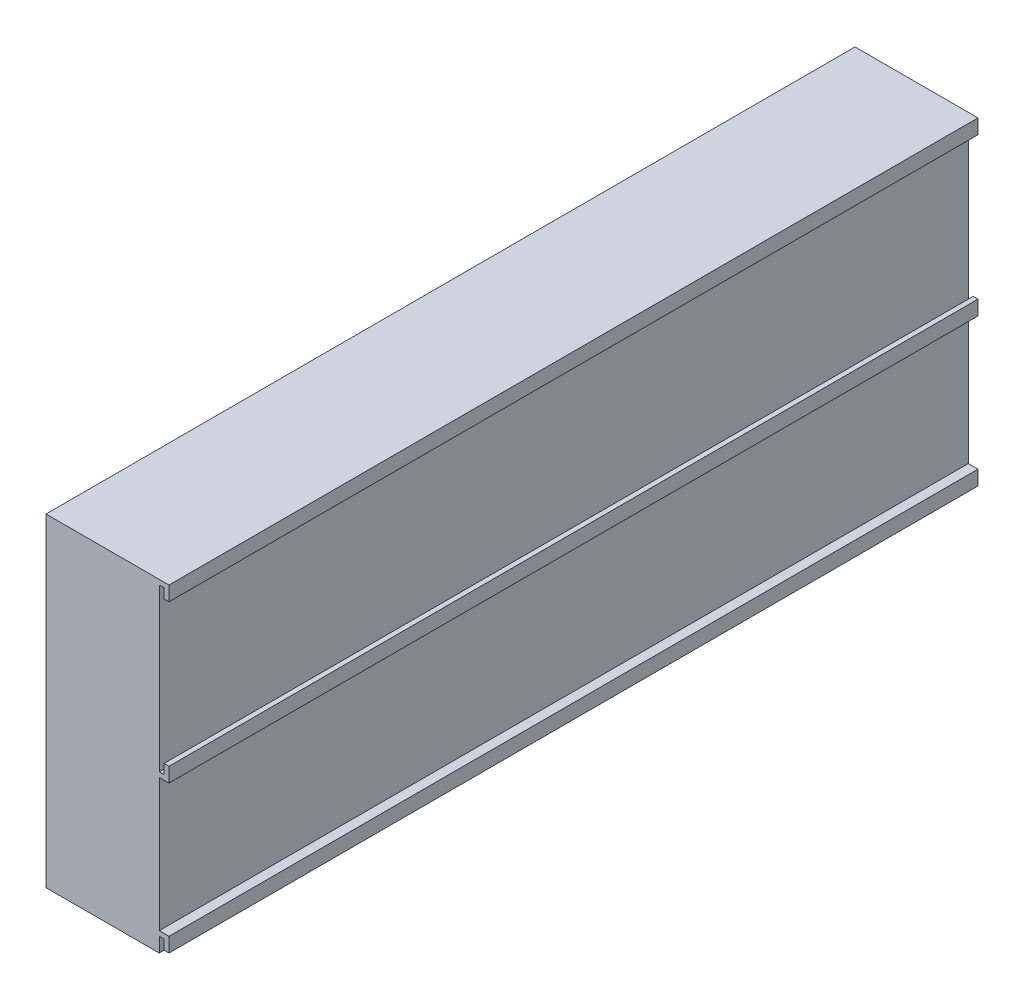
ISO-10303-21;
HEADER;
FILE_DESCRIPTION(('STEP AP214'),'2;1');
FILE_NAME('part.step','',(''),(''),'','','');
FILE_SCHEMA(('AUTOMOTIVE_DESIGN { 1 0 10303 214 1 1 1 1 }'));
ENDSEC;
DATA;
#1=APPLICATION_CONTEXT('core data for automotive mechanical design processes');
#2=APPLICATION_PROTOCOL_DEFINITION('international standard','automotive_design',2000,#1);
#3=PRODUCT_CONTEXT('',#1,'mechanical');
#4=PRODUCT('Part','Part','',(#3));
#5=PRODUCT_RELATED_PRODUCT_CATEGORY('part','',(#4));
#6=PRODUCT_DEFINITION_FORMATION('','',#4);
#7=PRODUCT_DEFINITION_CONTEXT('part definition',#1,'design');
#8=PRODUCT_DEFINITION('design','',#6,#7);
#9=PRODUCT_DEFINITION_SHAPE('','',#8);
#10=(LENGTH_UNIT() NAMED_UNIT(*) SI_UNIT(.MILLI.,.METRE.));
#11=(NAMED_UNIT(*) PLANE_ANGLE_UNIT() SI_UNIT($,.RADIAN.));
#12=(NAMED_UNIT(*) SI_UNIT($,.STERADIAN.) SOLID_ANGLE_UNIT());
#13=UNCERTAINTY_MEASURE_WITH_UNIT(LENGTH_MEASURE(1.E-05),#10,'distance_accuracy_value','');
#14=(GEOMETRIC_REPRESENTATION_CONTEXT(3) GLOBAL_UNCERTAINTY_ASSIGNED_CONTEXT((#13)) GLOBAL_UNIT_ASSIGNED_CONTEXT((#10,
#11,#12)) REPRESENTATION_CONTEXT('',''));
#15=CARTESIAN_POINT('',(0.,0.,0.));
#16=DIRECTION('',(0.,0.,1.));
#17=DIRECTION('',(1.,0.,0.));
#18=AXIS2_PLACEMENT_3D('',#15,#16,#17);
#19=CARTESIAN_POINT('',(-17.5,-50.,250.));
#20=DIRECTION('',(1.,0.,0.));
#21=DIRECTION('',(0.,0.,-1.));
#22=AXIS2_PLACEMENT_3D('',#19,#20,#21);
#23=PLANE('',#22);
#24=DIRECTION('',(0.,-1.,0.));
#25=VECTOR('',#24,1.);
#26=CARTESIAN_POINT('',(-17.5,-50.,0.));
#27=LINE('',#26,#25);
#28=CARTESIAN_POINT('',(-17.5,50.,0.));
#29=VERTEX_POINT('',#28);
#30=CARTESIAN_POINT('',(-17.5,-50.,0.));
#31=VERTEX_POINT('',#30);
#32=EDGE_CURVE('E216',#29,#31,#27,.T.);
#33=ORIENTED_EDGE('',*,*,#32,.T.);
#34=DIRECTION('',(0.,0.,-1.));
#35=VECTOR('',#34,1.);
#36=CARTESIAN_POINT('',(-17.5,-50.,250.));
#37=LINE('',#36,#35);
#38=CARTESIAN_POINT('',(-17.5,-50.,250.));
#39=VERTEX_POINT('',#38);
#40=EDGE_CURVE('E48',#39,#31,#37,.T.);
#41=ORIENTED_EDGE('',*,*,#40,.F.);
#42=DIRECTION('',(0.,-1.,0.));
#43=VECTOR('',#42,1.);
#44=CARTESIAN_POINT('',(-17.5,-50.,250.));
#45=LINE('',#44,#43);
#46=CARTESIAN_POINT('',(-17.5,50.,250.));
#47=VERTEX_POINT('',#46);
#48=EDGE_CURVE('E136',#47,#39,#45,.T.);
#49=ORIENTED_EDGE('',*,*,#48,.F.);
#50=DIRECTION('',(0.,0.,-1.));
#51=VECTOR('',#50,1.);
#52=CARTESIAN_POINT('',(-17.5,50.,250.));
#53=LINE('',#52,#51);
#54=EDGE_CURVE('E11',#47,#29,#53,.T.);
#55=ORIENTED_EDGE('',*,*,#54,.T.);
#56=EDGE_LOOP('',(#33,#41,#49,#55));
#57=FACE_BOUND('',#56,.T.);
#58=ADVANCED_FACE('F39',(#57),#23,.F.);
#59=CARTESIAN_POINT('',(-17.5,-50.,250.));
#60=DIRECTION('',(0.,1.,0.));
#61=DIRECTION('',(0.,0.,1.));
#62=AXIS2_PLACEMENT_3D('',#59,#60,#61);
#63=PLANE('',#62);
#64=DIRECTION('',(1.,0.,0.));
#65=VECTOR('',#64,1.);
#66=CARTESIAN_POINT('',(-17.5,-50.,0.));
#67=LINE('',#66,#65);
#68=CARTESIAN_POINT('',(17.5,-50.,0.));
#69=VERTEX_POINT('',#68);
#70=EDGE_CURVE('E219',#31,#69,#67,.T.);
#71=ORIENTED_EDGE('',*,*,#70,.T.);
#72=DIRECTION('',(0.,0.,-1.));
#73=VECTOR('',#72,1.);
#74=CARTESIAN_POINT('',(17.5,-50.,250.));
#75=LINE('',#74,#73);
#76=CARTESIAN_POINT('',(17.5,-50.,250.));
#77=VERTEX_POINT('',#76);
#78=EDGE_CURVE('E331',#77,#69,#75,.T.);
#79=ORIENTED_EDGE('',*,*,#78,.F.);
#80=DIRECTION('',(1.,0.,0.));
#81=VECTOR('',#80,1.);
#82=CARTESIAN_POINT('',(-17.5,-50.,250.));
#83=LINE('',#82,#81);
#84=EDGE_CURVE('E341',#39,#77,#83,.T.);
#85=ORIENTED_EDGE('',*,*,#84,.F.);
#86=ORIENTED_EDGE('',*,*,#40,.T.);
#87=EDGE_LOOP('',(#71,#79,#85,#86));
#88=FACE_BOUND('',#87,.T.);
#89=ADVANCED_FACE('F339',(#88),#63,.F.);
#90=CARTESIAN_POINT('',(17.5,-50.,250.));
#91=DIRECTION('',(-1.,0.,0.));
#92=DIRECTION('',(0.,0.,1.));
#93=AXIS2_PLACEMENT_3D('',#90,#91,#92);
#94=PLANE('',#93);
#95=DIRECTION('',(0.,1.,0.));
#96=VECTOR('',#95,1.);
#97=CARTESIAN_POINT('',(17.5,-50.,0.));
#98=LINE('',#97,#96);
#99=CARTESIAN_POINT('',(17.5,-45.5,0.));
#100=VERTEX_POINT('',#99);
#101=EDGE_CURVE('E222',#69,#100,#98,.T.);
#102=ORIENTED_EDGE('',*,*,#101,.T.);
#103=DIRECTION('',(0.,0.,-1.));
#104=VECTOR('',#103,1.);
#105=CARTESIAN_POINT('',(17.5,-45.5,250.));
#106=LINE('',#105,#104);
#107=CARTESIAN_POINT('',(17.5,-45.5,250.));
#108=VERTEX_POINT('',#107);
#109=EDGE_CURVE('E327',#108,#100,#106,.T.);
#110=ORIENTED_EDGE('',*,*,#109,.F.);
#111=DIRECTION('',(0.,1.,0.));
#112=VECTOR('',#111,1.);
#113=CARTESIAN_POINT('',(17.5,-50.,250.));
#114=LINE('',#113,#112);
#115=EDGE_CURVE('E361',#77,#108,#114,.T.);
#116=ORIENTED_EDGE('',*,*,#115,.F.);
#117=ORIENTED_EDGE('',*,*,#78,.T.);
#118=EDGE_LOOP('',(#102,#110,#116,#117));
#119=FACE_BOUND('',#118,.T.);
#120=ADVANCED_FACE('F351',(#119),#94,.F.);
#121=CARTESIAN_POINT('',(19.,-45.5,250.));
#122=DIRECTION('',(0.,1.,0.));
#123=DIRECTION('',(0.,0.,1.));
#124=AXIS2_PLACEMENT_3D('',#121,#122,#123);
#125=PLANE('',#124);
#126=DIRECTION('',(1.,0.,0.));
#127=VECTOR('',#126,1.);
#128=CARTESIAN_POINT('',(19.,-45.5,0.));
#129=LINE('',#128,#127);
#130=CARTESIAN_POINT('',(19.,-45.5,0.));
#131=VERTEX_POINT('',#130);
#132=EDGE_CURVE('E225',#100,#131,#129,.T.);
#133=ORIENTED_EDGE('',*,*,#132,.T.);
#134=DIRECTION('',(0.,0.,-1.));
#135=VECTOR('',#134,1.);
#136=CARTESIAN_POINT('',(19.,-45.5,250.));
#137=LINE('',#136,#135);
#138=CARTESIAN_POINT('',(19.,-45.5,250.));
#139=VERTEX_POINT('',#138);
#140=EDGE_CURVE('E323',#139,#131,#137,.T.);
#141=ORIENTED_EDGE('',*,*,#140,.F.);
#142=DIRECTION('',(1.,0.,0.));
#143=VECTOR('',#142,1.);
#144=CARTESIAN_POINT('',(19.,-45.5,250.));
#145=LINE('',#144,#143);
#146=EDGE_CURVE('E357',#108,#139,#145,.T.);
#147=ORIENTED_EDGE('',*,*,#146,.F.);
#148=ORIENTED_EDGE('',*,*,#109,.T.);
#149=EDGE_LOOP('',(#133,#141,#147,#148));
#150=FACE_BOUND('',#149,.T.);
#151=ADVANCED_FACE('F355',(#150),#125,.F.);
#152=CARTESIAN_POINT('',(19.,-48.5,250.));
#153=DIRECTION('',(1.,0.,0.));
#154=DIRECTION('',(0.,1.,0.));
#155=AXIS2_PLACEMENT_3D('',#152,#153,#154);
#156=PLANE('',#155);
#157=DIRECTION('',(0.,-1.,0.));
#158=VECTOR('',#157,1.);
#159=CARTESIAN_POINT('',(19.,-48.5,0.));
#160=LINE('',#159,#158);
#161=CARTESIAN_POINT('',(19.,-48.5,0.));
#162=VERTEX_POINT('',#161);
#163=EDGE_CURVE('E228',#131,#162,#160,.T.);
#164=ORIENTED_EDGE('',*,*,#163,.T.);
#165=DIRECTION('',(0.,0.,-1.));
#166=VECTOR('',#165,1.);
#167=CARTESIAN_POINT('',(19.,-48.5,250.));
#168=LINE('',#167,#166);
#169=CARTESIAN_POINT('',(19.,-48.5,250.));
#170=VERTEX_POINT('',#169);
#171=EDGE_CURVE('E319',#170,#162,#168,.T.);
#172=ORIENTED_EDGE('',*,*,#171,.F.);
#173=DIRECTION('',(0.,-1.,0.));
#174=VECTOR('',#173,1.);
#175=CARTESIAN_POINT('',(19.,-48.5,250.));
#176=LINE('',#175,#174);
#177=EDGE_CURVE('E360',#139,#170,#176,.T.);
#178=ORIENTED_EDGE('',*,*,#177,.F.);
#179=ORIENTED_EDGE('',*,*,#140,.T.);
#180=EDGE_LOOP('',(#164,#172,#178,#179));
#181=FACE_BOUND('',#180,.T.);
#182=ADVANCED_FACE('F435',(#181),#156,.F.);
#183=CARTESIAN_POINT('',(20.5,-48.5,250.));
#184=DIRECTION('',(0.,1.,0.));
#185=DIRECTION('',(0.,0.,1.));
#186=AXIS2_PLACEMENT_3D('',#183,#184,#185);
#187=PLANE('',#186);
#188=DIRECTION('',(1.,0.,0.));
#189=VECTOR('',#188,1.);
#190=CARTESIAN_POINT('',(20.5,-48.5,0.));
#191=LINE('',#190,#189);
#192=CARTESIAN_POINT('',(20.5,-48.5,0.));
#193=VERTEX_POINT('',#192);
#194=EDGE_CURVE('E231',#162,#193,#191,.T.);
#195=ORIENTED_EDGE('',*,*,#194,.T.);
#196=DIRECTION('',(0.,0.,-1.));
#197=VECTOR('',#196,1.);
#198=CARTESIAN_POINT('',(20.5,-48.5,250.));
#199=LINE('',#198,#197);
#200=CARTESIAN_POINT('',(20.5,-48.5,250.));
#201=VERTEX_POINT('',#200);
#202=EDGE_CURVE('E315',#201,#193,#199,.T.);
#203=ORIENTED_EDGE('',*,*,#202,.F.);
#204=DIRECTION('',(1.,0.,0.));
#205=VECTOR('',#204,1.);
#206=CARTESIAN_POINT('',(20.5,-48.5,250.));
#207=LINE('',#206,#205);
#208=EDGE_CURVE('E365',#170,#201,#207,.T.);
#209=ORIENTED_EDGE('',*,*,#208,.F.);
#210=ORIENTED_EDGE('',*,*,#171,.T.);
#211=EDGE_LOOP('',(#195,#203,#209,#210));
#212=FACE_BOUND('',#211,.T.);
#213=ADVANCED_FACE('F438',(#212),#187,.F.);
#214=CARTESIAN_POINT('',(20.5,-44.,250.));
#215=DIRECTION('',(-1.,0.,0.));
#216=DIRECTION('',(0.,0.,1.));
#217=AXIS2_PLACEMENT_3D('',#214,#215,#216);
#218=PLANE('',#217);
#219=DIRECTION('',(0.,1.,0.));
#220=VECTOR('',#219,1.);
#221=CARTESIAN_POINT('',(20.5,-44.,0.));
#222=LINE('',#221,#220);
#223=CARTESIAN_POINT('',(20.5,-44.,0.));
#224=VERTEX_POINT('',#223);
#225=EDGE_CURVE('E234',#193,#224,#222,.T.);
#226=ORIENTED_EDGE('',*,*,#225,.T.);
#227=DIRECTION('',(0.,0.,-1.));
#228=VECTOR('',#227,1.);
#229=CARTESIAN_POINT('',(20.5,-44.,250.));
#230=LINE('',#229,#228);
#231=CARTESIAN_POINT('',(20.5,-44.,250.));
#232=VERTEX_POINT('',#231);
#233=EDGE_CURVE('E311',#232,#224,#230,.T.);
#234=ORIENTED_EDGE('',*,*,#233,.F.);
#235=DIRECTION('',(0.,1.,0.));
#236=VECTOR('',#235,1.);
#237=CARTESIAN_POINT('',(20.5,-44.,250.));
#238=LINE('',#237,#236);
#239=EDGE_CURVE('E372',#201,#232,#238,.T.);
#240=ORIENTED_EDGE('',*,*,#239,.F.);
#241=ORIENTED_EDGE('',*,*,#202,.T.);
#242=EDGE_LOOP('',(#226,#234,#240,#241));
#243=FACE_BOUND('',#242,.T.);
#244=ADVANCED_FACE('F442',(#243),#218,.F.);
#245=CARTESIAN_POINT('',(17.5,-44.,250.));
#246=DIRECTION('',(0.,-1.,0.));
#247=DIRECTION('',(1.,0.,0.));
#248=AXIS2_PLACEMENT_3D('',#245,#246,#247);
#249=PLANE('',#248);
#250=DIRECTION('',(-1.,0.,0.));
#251=VECTOR('',#250,1.);
#252=CARTESIAN_POINT('',(17.5,-44.,0.));
#253=LINE('',#252,#251);
#254=CARTESIAN_POINT('',(17.5,-44.,0.));
#255=VERTEX_POINT('',#254);
#256=EDGE_CURVE('E237',#224,#255,#253,.T.);
#257=ORIENTED_EDGE('',*,*,#256,.T.);
#258=DIRECTION('',(0.,0.,-1.));
#259=VECTOR('',#258,1.);
#260=CARTESIAN_POINT('',(17.5,-44.,250.));
#261=LINE('',#260,#259);
#262=CARTESIAN_POINT('',(17.5,-44.,250.));
#263=VERTEX_POINT('',#262);
#264=EDGE_CURVE('E307',#263,#255,#261,.T.);
#265=ORIENTED_EDGE('',*,*,#264,.F.);
#266=DIRECTION('',(-1.,0.,0.));
#267=VECTOR('',#266,1.);
#268=CARTESIAN_POINT('',(17.5,-44.,250.));
#269=LINE('',#268,#267);
#270=EDGE_CURVE('E375',#232,#263,#269,.T.);
#271=ORIENTED_EDGE('',*,*,#270,.F.);
#272=ORIENTED_EDGE('',*,*,#233,.T.);
#273=EDGE_LOOP('',(#257,#265,#271,#272));
#274=FACE_BOUND('',#273,.T.);
#275=ADVANCED_FACE('F446',(#274),#249,.F.);
#276=CARTESIAN_POINT('',(17.5,-44.,250.));
#277=DIRECTION('',(-1.,0.,0.));
#278=DIRECTION('',(0.,0.,1.));
#279=AXIS2_PLACEMENT_3D('',#276,#277,#278);
#280=PLANE('',#279);
#281=DIRECTION('',(0.,1.,0.));
#282=VECTOR('',#281,1.);
#283=CARTESIAN_POINT('',(17.5,-44.,0.));
#284=LINE('',#283,#282);
#285=CARTESIAN_POINT('',(17.5,-3.,0.));
#286=VERTEX_POINT('',#285);
#287=EDGE_CURVE('E240',#255,#286,#284,.T.);
#288=ORIENTED_EDGE('',*,*,#287,.T.);
#289=DIRECTION('',(0.,0.,-1.));
#290=VECTOR('',#289,1.);
#291=CARTESIAN_POINT('',(17.5,-3.,250.));
#292=LINE('',#291,#290);
#293=CARTESIAN_POINT('',(17.5,-3.,250.));
#294=VERTEX_POINT('',#293);
#295=EDGE_CURVE('E303',#294,#286,#292,.T.);
#296=ORIENTED_EDGE('',*,*,#295,.F.);
#297=DIRECTION('',(0.,1.,0.));
#298=VECTOR('',#297,1.);
#299=CARTESIAN_POINT('',(17.5,-44.,250.));
#300=LINE('',#299,#298);
#301=EDGE_CURVE('E378',#263,#294,#300,.T.);
#302=ORIENTED_EDGE('',*,*,#301,.F.);
#303=ORIENTED_EDGE('',*,*,#264,.T.);
#304=EDGE_LOOP('',(#288,#296,#302,#303));
#305=FACE_BOUND('',#304,.T.);
#306=ADVANCED_FACE('F450',(#305),#280,.F.);
#307=CARTESIAN_POINT('',(17.5,-3.,250.));
#308=DIRECTION('',(0.,1.,0.));
#309=DIRECTION('',(-1.,0.,0.));
#310=AXIS2_PLACEMENT_3D('',#307,#308,#309);
#311=PLANE('',#310);
#312=DIRECTION('',(1.,0.,0.));
#313=VECTOR('',#312,1.);
#314=CARTESIAN_POINT('',(17.5,-3.,0.));
#315=LINE('',#314,#313);
#316=CARTESIAN_POINT('',(20.5,-3.,0.));
#317=VERTEX_POINT('',#316);
#318=EDGE_CURVE('E243',#286,#317,#315,.T.);
#319=ORIENTED_EDGE('',*,*,#318,.T.);
#320=DIRECTION('',(0.,0.,-1.));
#321=VECTOR('',#320,1.);
#322=CARTESIAN_POINT('',(20.5,-3.,250.));
#323=LINE('',#322,#321);
#324=CARTESIAN_POINT('',(20.5,-3.,250.));
#325=VERTEX_POINT('',#324);
#326=EDGE_CURVE('E299',#325,#317,#323,.T.);
#327=ORIENTED_EDGE('',*,*,#326,.F.);
#328=DIRECTION('',(1.,0.,0.));
#329=VECTOR('',#328,1.);
#330=CARTESIAN_POINT('',(17.5,-3.,250.));
#331=LINE('',#330,#329);
#332=EDGE_CURVE('E381',#294,#325,#331,.T.);
#333=ORIENTED_EDGE('',*,*,#332,.F.);
#334=ORIENTED_EDGE('',*,*,#295,.T.);
#335=EDGE_LOOP('',(#319,#327,#333,#334));
#336=FACE_BOUND('',#335,.T.);
#337=ADVANCED_FACE('F454',(#336),#311,.F.);
#338=CARTESIAN_POINT('',(20.5,-3.,250.));
#339=DIRECTION('',(-1.,0.,0.));
#340=DIRECTION('',(0.,0.,1.));
#341=AXIS2_PLACEMENT_3D('',#338,#339,#340);
#342=PLANE('',#341);
#343=DIRECTION('',(0.,1.,0.));
#344=VECTOR('',#343,1.);
#345=CARTESIAN_POINT('',(20.5,-3.,0.));
#346=LINE('',#345,#344);
#347=CARTESIAN_POINT('',(20.5,1.5,0.));
#348=VERTEX_POINT('',#347);
#349=EDGE_CURVE('E246',#317,#348,#346,.T.);
#350=ORIENTED_EDGE('',*,*,#349,.T.);
#351=DIRECTION('',(0.,0.,-1.));
#352=VECTOR('',#351,1.);
#353=CARTESIAN_POINT('',(20.5,1.5,250.));
#354=LINE('',#353,#352);
#355=CARTESIAN_POINT('',(20.5,1.5,250.));
#356=VERTEX_POINT('',#355);
#357=EDGE_CURVE('E295',#356,#348,#354,.T.);
#358=ORIENTED_EDGE('',*,*,#357,.F.);
#359=DIRECTION('',(0.,1.,0.));
#360=VECTOR('',#359,1.);
#361=CARTESIAN_POINT('',(20.5,-3.,250.));
#362=LINE('',#361,#360);
#363=EDGE_CURVE('E384',#325,#356,#362,.T.);
#364=ORIENTED_EDGE('',*,*,#363,.F.);
#365=ORIENTED_EDGE('',*,*,#326,.T.);
#366=EDGE_LOOP('',(#350,#358,#364,#365));
#367=FACE_BOUND('',#366,.T.);
#368=ADVANCED_FACE('F458',(#367),#342,.F.);
#369=CARTESIAN_POINT('',(20.5,1.5,250.));
#370=DIRECTION('',(0.,-1.,0.));
#371=DIRECTION('',(1.,0.,0.));
#372=AXIS2_PLACEMENT_3D('',#369,#370,#371);
#373=PLANE('',#372);
#374=DIRECTION('',(-1.,0.,0.));
#375=VECTOR('',#374,1.);
#376=CARTESIAN_POINT('',(20.5,1.5,0.));
#377=LINE('',#376,#375);
#378=CARTESIAN_POINT('',(19.,1.5,0.));
#379=VERTEX_POINT('',#378);
#380=EDGE_CURVE('E249',#348,#379,#377,.T.);
#381=ORIENTED_EDGE('',*,*,#380,.T.);
#382=DIRECTION('',(0.,0.,-1.));
#383=VECTOR('',#382,1.);
#384=CARTESIAN_POINT('',(19.,1.5,250.));
#385=LINE('',#384,#383);
#386=CARTESIAN_POINT('',(19.,1.5,250.));
#387=VERTEX_POINT('',#386);
#388=EDGE_CURVE('E291',#387,#379,#385,.T.);
#389=ORIENTED_EDGE('',*,*,#388,.F.);
#390=DIRECTION('',(-1.,0.,0.));
#391=VECTOR('',#390,1.);
#392=CARTESIAN_POINT('',(20.5,1.5,250.));
#393=LINE('',#392,#391);
#394=EDGE_CURVE('E387',#356,#387,#393,.T.);
#395=ORIENTED_EDGE('',*,*,#394,.F.);
#396=ORIENTED_EDGE('',*,*,#357,.T.);
#397=EDGE_LOOP('',(#381,#389,#395,#396));
#398=FACE_BOUND('',#397,.T.);
#399=ADVANCED_FACE('F462',(#398),#373,.F.);
#400=CARTESIAN_POINT('',(19.,1.5,250.));
#401=DIRECTION('',(1.,0.,0.));
#402=DIRECTION('',(0.,0.,-1.));
#403=AXIS2_PLACEMENT_3D('',#400,#401,#402);
#404=PLANE('',#403);
#405=DIRECTION('',(0.,-1.,0.));
#406=VECTOR('',#405,1.);
#407=CARTESIAN_POINT('',(19.,1.5,0.));
#408=LINE('',#407,#406);
#409=CARTESIAN_POINT('',(19.,-1.5,0.));
#410=VERTEX_POINT('',#409);
#411=EDGE_CURVE('E252',#379,#410,#408,.T.);
#412=ORIENTED_EDGE('',*,*,#411,.T.);
#413=DIRECTION('',(0.,0.,-1.));
#414=VECTOR('',#413,1.);
#415=CARTESIAN_POINT('',(19.,-1.5,250.));
#416=LINE('',#415,#414);
#417=CARTESIAN_POINT('',(19.,-1.5,250.));
#418=VERTEX_POINT('',#417);
#419=EDGE_CURVE('E287',#418,#410,#416,.T.);
#420=ORIENTED_EDGE('',*,*,#419,.F.);
#421=DIRECTION('',(0.,-1.,0.));
#422=VECTOR('',#421,1.);
#423=CARTESIAN_POINT('',(19.,1.5,250.));
#424=LINE('',#423,#422);
#425=EDGE_CURVE('E390',#387,#418,#424,.T.);
#426=ORIENTED_EDGE('',*,*,#425,.F.);
#427=ORIENTED_EDGE('',*,*,#388,.T.);
#428=EDGE_LOOP('',(#412,#420,#426,#427));
#429=FACE_BOUND('',#428,.T.);
#430=ADVANCED_FACE('F466',(#429),#404,.F.);
#431=CARTESIAN_POINT('',(19.,-1.5,250.));
#432=DIRECTION('',(0.,-1.,0.));
#433=DIRECTION('',(1.,0.,0.));
#434=AXIS2_PLACEMENT_3D('',#431,#432,#433);
#435=PLANE('',#434);
#436=DIRECTION('',(-1.,0.,0.));
#437=VECTOR('',#436,1.);
#438=CARTESIAN_POINT('',(19.,-1.5,0.));
#439=LINE('',#438,#437);
#440=CARTESIAN_POINT('',(17.5,-1.5,0.));
#441=VERTEX_POINT('',#440);
#442=EDGE_CURVE('E255',#410,#441,#439,.T.);
#443=ORIENTED_EDGE('',*,*,#442,.T.);
#444=DIRECTION('',(0.,0.,-1.));
#445=VECTOR('',#444,1.);
#446=CARTESIAN_POINT('',(17.5,-1.5,250.));
#447=LINE('',#446,#445);
#448=CARTESIAN_POINT('',(17.5,-1.5,250.));
#449=VERTEX_POINT('',#448);
#450=EDGE_CURVE('E283',#449,#441,#447,.T.);
#451=ORIENTED_EDGE('',*,*,#450,.F.);
#452=DIRECTION('',(-1.,0.,0.));
#453=VECTOR('',#452,1.);
#454=CARTESIAN_POINT('',(19.,-1.5,250.));
#455=LINE('',#454,#453);
#456=EDGE_CURVE('E393',#418,#449,#455,.T.);
#457=ORIENTED_EDGE('',*,*,#456,.F.);
#458=ORIENTED_EDGE('',*,*,#419,.T.);
#459=EDGE_LOOP('',(#443,#451,#457,#458));
#460=FACE_BOUND('',#459,.T.);
#461=ADVANCED_FACE('F470',(#460),#435,.F.);
#462=CARTESIAN_POINT('',(17.5,-1.5,250.));
#463=DIRECTION('',(-1.,0.,0.));
#464=DIRECTION('',(0.,0.,1.));
#465=AXIS2_PLACEMENT_3D('',#462,#463,#464);
#466=PLANE('',#465);
#467=DIRECTION('',(0.,1.,0.));
#468=VECTOR('',#467,1.);
#469=CARTESIAN_POINT('',(17.5,-1.5,0.));
#470=LINE('',#469,#468);
#471=CARTESIAN_POINT('',(17.5,48.5,0.));
#472=VERTEX_POINT('',#471);
#473=EDGE_CURVE('E258',#441,#472,#470,.T.);
#474=ORIENTED_EDGE('',*,*,#473,.T.);
#475=DIRECTION('',(0.,0.,-1.));
#476=VECTOR('',#475,1.);
#477=CARTESIAN_POINT('',(17.5,48.5,250.));
#478=LINE('',#477,#476);
#479=CARTESIAN_POINT('',(17.5,48.5,250.));
#480=VERTEX_POINT('',#479);
#481=EDGE_CURVE('E279',#480,#472,#478,.T.);
#482=ORIENTED_EDGE('',*,*,#481,.F.);
#483=DIRECTION('',(0.,1.,0.));
#484=VECTOR('',#483,1.);
#485=CARTESIAN_POINT('',(17.5,-1.5,250.));
#486=LINE('',#485,#484);
#487=EDGE_CURVE('E396',#449,#480,#486,.T.);
#488=ORIENTED_EDGE('',*,*,#487,.F.);
#489=ORIENTED_EDGE('',*,*,#450,.T.);
#490=EDGE_LOOP('',(#474,#482,#488,#489));
#491=FACE_BOUND('',#490,.T.);
#492=ADVANCED_FACE('F404',(#491),#466,.F.);
#493=CARTESIAN_POINT('',(19.,48.5,250.));
#494=DIRECTION('',(0.,1.,0.));
#495=DIRECTION('',(0.,0.,1.));
#496=AXIS2_PLACEMENT_3D('',#493,#494,#495);
#497=PLANE('',#496);
#498=DIRECTION('',(1.,0.,0.));
#499=VECTOR('',#498,1.);
#500=CARTESIAN_POINT('',(19.,48.5,0.));
#501=LINE('',#500,#499);
#502=CARTESIAN_POINT('',(19.,48.5,0.));
#503=VERTEX_POINT('',#502);
#504=EDGE_CURVE('E261',#472,#503,#501,.T.);
#505=ORIENTED_EDGE('',*,*,#504,.T.);
#506=DIRECTION('',(0.,0.,-1.));
#507=VECTOR('',#506,1.);
#508=CARTESIAN_POINT('',(19.,48.5,250.));
#509=LINE('',#508,#507);
#510=CARTESIAN_POINT('',(19.,48.5,250.));
#511=VERTEX_POINT('',#510);
#512=EDGE_CURVE('E203',#511,#503,#509,.T.);
#513=ORIENTED_EDGE('',*,*,#512,.F.);
#514=DIRECTION('',(1.,0.,0.));
#515=VECTOR('',#514,1.);
#516=CARTESIAN_POINT('',(19.,48.5,250.));
#517=LINE('',#516,#515);
#518=EDGE_CURVE('E192',#480,#511,#517,.T.);
#519=ORIENTED_EDGE('',*,*,#518,.F.);
#520=ORIENTED_EDGE('',*,*,#481,.T.);
#521=EDGE_LOOP('',(#505,#513,#519,#520));
#522=FACE_BOUND('',#521,.T.);
#523=ADVANCED_FACE('F408',(#522),#497,.F.);
#524=CARTESIAN_POINT('',(19.,45.5,250.));
#525=DIRECTION('',(1.,0.,0.));
#526=DIRECTION('',(0.,1.,0.));
#527=AXIS2_PLACEMENT_3D('',#524,#525,#526);
#528=PLANE('',#527);
#529=DIRECTION('',(0.,-1.,0.));
#530=VECTOR('',#529,1.);
#531=CARTESIAN_POINT('',(19.,45.5,0.));
#532=LINE('',#531,#530);
#533=CARTESIAN_POINT('',(19.,45.5,0.));
#534=VERTEX_POINT('',#533);
#535=EDGE_CURVE('E201',#503,#534,#532,.T.);
#536=ORIENTED_EDGE('',*,*,#535,.T.);
#537=DIRECTION('',(0.,0.,-1.));
#538=VECTOR('',#537,1.);
#539=CARTESIAN_POINT('',(19.,45.5,250.));
#540=LINE('',#539,#538);
#541=CARTESIAN_POINT('',(19.,45.5,250.));
#542=VERTEX_POINT('',#541);
#543=EDGE_CURVE('E198',#542,#534,#540,.T.);
#544=ORIENTED_EDGE('',*,*,#543,.F.);
#545=DIRECTION('',(0.,-1.,0.));
#546=VECTOR('',#545,1.);
#547=CARTESIAN_POINT('',(19.,45.5,250.));
#548=LINE('',#547,#546);
#549=EDGE_CURVE('E186',#511,#542,#548,.T.);
#550=ORIENTED_EDGE('',*,*,#549,.F.);
#551=ORIENTED_EDGE('',*,*,#512,.T.);
#552=EDGE_LOOP('',(#536,#544,#550,#551));
#553=FACE_BOUND('',#552,.T.);
#554=ADVANCED_FACE('F199',(#553),#528,.F.);
#555=CARTESIAN_POINT('',(20.5,45.5,250.));
#556=DIRECTION('',(0.,1.,0.));
#557=DIRECTION('',(0.,0.,1.));
#558=AXIS2_PLACEMENT_3D('',#555,#556,#557);
#559=PLANE('',#558);
#560=DIRECTION('',(1.,0.,0.));
#561=VECTOR('',#560,1.);
#562=CARTESIAN_POINT('',(20.5,45.5,0.));
#563=LINE('',#562,#561);
#564=CARTESIAN_POINT('',(20.5,45.5,0.));
#565=VERTEX_POINT('',#564);
#566=EDGE_CURVE('E122',#534,#565,#563,.T.);
#567=ORIENTED_EDGE('',*,*,#566,.T.);
#568=DIRECTION('',(0.,0.,-1.));
#569=VECTOR('',#568,1.);
#570=CARTESIAN_POINT('',(20.5,45.5,250.));
#571=LINE('',#570,#569);
#572=CARTESIAN_POINT('',(20.5,45.5,250.));
#573=VERTEX_POINT('',#572);
#574=EDGE_CURVE('E204',#573,#565,#571,.T.);
#575=ORIENTED_EDGE('',*,*,#574,.F.);
#576=DIRECTION('',(1.,0.,0.));
#577=VECTOR('',#576,1.);
#578=CARTESIAN_POINT('',(20.5,45.5,250.));
#579=LINE('',#578,#577);
#580=EDGE_CURVE('E190',#542,#573,#579,.T.);
#581=ORIENTED_EDGE('',*,*,#580,.F.);
#582=ORIENTED_EDGE('',*,*,#543,.T.);
#583=EDGE_LOOP('',(#567,#575,#581,#582));
#584=FACE_BOUND('',#583,.T.);
#585=ADVANCED_FACE('F206',(#584),#559,.F.);
#586=CARTESIAN_POINT('',(20.5,50.,250.));
#587=DIRECTION('',(-1.,0.,0.));
#588=DIRECTION('',(0.,0.,1.));
#589=AXIS2_PLACEMENT_3D('',#586,#587,#588);
#590=PLANE('',#589);
#591=DIRECTION('',(0.,1.,0.));
#592=VECTOR('',#591,1.);
#593=CARTESIAN_POINT('',(20.5,50.,0.));
#594=LINE('',#593,#592);
#595=CARTESIAN_POINT('',(20.5,50.,0.));
#596=VERTEX_POINT('',#595);
#597=EDGE_CURVE('E129',#565,#596,#594,.T.);
#598=ORIENTED_EDGE('',*,*,#597,.T.);
#599=DIRECTION('',(0.,0.,-1.));
#600=VECTOR('',#599,1.);
#601=CARTESIAN_POINT('',(20.5,50.,250.));
#602=LINE('',#601,#600);
#603=CARTESIAN_POINT('',(20.5,50.,250.));
#604=VERTEX_POINT('',#603);
#605=EDGE_CURVE('E212',#604,#596,#602,.T.);
#606=ORIENTED_EDGE('',*,*,#605,.F.);
#607=DIRECTION('',(0.,1.,0.));
#608=VECTOR('',#607,1.);
#609=CARTESIAN_POINT('',(20.5,50.,250.));
#610=LINE('',#609,#608);
#611=EDGE_CURVE('E209',#573,#604,#610,.T.);
#612=ORIENTED_EDGE('',*,*,#611,.F.);
#613=ORIENTED_EDGE('',*,*,#574,.T.);
#614=EDGE_LOOP('',(#598,#606,#612,#613));
#615=FACE_BOUND('',#614,.T.);
#616=ADVANCED_FACE('F410',(#615),#590,.F.);
#617=CARTESIAN_POINT('',(17.5,50.,250.));
#618=DIRECTION('',(0.,-1.,0.));
#619=DIRECTION('',(0.,0.,-1.));
#620=AXIS2_PLACEMENT_3D('',#617,#618,#619);
#621=PLANE('',#620);
#622=DIRECTION('',(-1.,0.,0.));
#623=VECTOR('',#622,1.);
#624=CARTESIAN_POINT('',(17.5,50.,0.));
#625=LINE('',#624,#623);
#626=EDGE_CURVE('E270',#596,#29,#625,.T.);
#627=ORIENTED_EDGE('',*,*,#626,.T.);
#628=ORIENTED_EDGE('',*,*,#54,.F.);
#629=DIRECTION('',(-1.,0.,0.));
#630=VECTOR('',#629,1.);
#631=CARTESIAN_POINT('',(-17.5,50.,250.));
#632=LINE('',#631,#630);
#633=EDGE_CURVE('E56',#604,#47,#632,.T.);
#634=ORIENTED_EDGE('',*,*,#633,.F.);
#635=ORIENTED_EDGE('',*,*,#605,.T.);
#636=EDGE_LOOP('',(#627,#628,#634,#635));
#637=FACE_BOUND('',#636,.T.);
#638=ADVANCED_FACE('F409',(#637),#621,.F.);
#639=CARTESIAN_POINT('',(0.,0.,250.));
#640=DIRECTION('',(0.,0.,-1.));
#641=DIRECTION('',(-1.,0.,0.));
#642=AXIS2_PLACEMENT_3D('',#639,#640,#641);
#643=PLANE('',#642);
#644=ORIENTED_EDGE('',*,*,#633,.T.);
#645=ORIENTED_EDGE('',*,*,#48,.T.);
#646=ORIENTED_EDGE('',*,*,#84,.T.);
#647=ORIENTED_EDGE('',*,*,#115,.T.);
#648=ORIENTED_EDGE('',*,*,#146,.T.);
#649=ORIENTED_EDGE('',*,*,#177,.T.);
#650=ORIENTED_EDGE('',*,*,#208,.T.);
#651=ORIENTED_EDGE('',*,*,#239,.T.);
#652=ORIENTED_EDGE('',*,*,#270,.T.);
#653=ORIENTED_EDGE('',*,*,#301,.T.);
#654=ORIENTED_EDGE('',*,*,#332,.T.);
#655=ORIENTED_EDGE('',*,*,#363,.T.);
#656=ORIENTED_EDGE('',*,*,#394,.T.);
#657=ORIENTED_EDGE('',*,*,#425,.T.);
#658=ORIENTED_EDGE('',*,*,#456,.T.);
#659=ORIENTED_EDGE('',*,*,#487,.T.);
#660=ORIENTED_EDGE('',*,*,#518,.T.);
#661=ORIENTED_EDGE('',*,*,#549,.T.);
#662=ORIENTED_EDGE('',*,*,#580,.T.);
#663=ORIENTED_EDGE('',*,*,#611,.T.);
#664=EDGE_LOOP('',(#644,#645,#646,#647,#648,#649,#650,#651,#652,#653,#654,#655,#656,#657,#658,
#659,#660,#661,#662,#663));
#665=FACE_BOUND('',#664,.T.);
#666=ADVANCED_FACE('F188',(#665),#643,.F.);
#667=CARTESIAN_POINT('',(0.,0.,0.));
#668=DIRECTION('',(0.,0.,-1.));
#669=DIRECTION('',(-1.,0.,0.));
#670=AXIS2_PLACEMENT_3D('',#667,#668,#669);
#671=PLANE('',#670);
#672=ORIENTED_EDGE('',*,*,#32,.F.);
#673=ORIENTED_EDGE('',*,*,#626,.F.);
#674=ORIENTED_EDGE('',*,*,#597,.F.);
#675=ORIENTED_EDGE('',*,*,#566,.F.);
#676=ORIENTED_EDGE('',*,*,#535,.F.);
#677=ORIENTED_EDGE('',*,*,#504,.F.);
#678=ORIENTED_EDGE('',*,*,#473,.F.);
#679=ORIENTED_EDGE('',*,*,#442,.F.);
#680=ORIENTED_EDGE('',*,*,#411,.F.);
#681=ORIENTED_EDGE('',*,*,#380,.F.);
#682=ORIENTED_EDGE('',*,*,#349,.F.);
#683=ORIENTED_EDGE('',*,*,#318,.F.);
#684=ORIENTED_EDGE('',*,*,#287,.F.);
#685=ORIENTED_EDGE('',*,*,#256,.F.);
#686=ORIENTED_EDGE('',*,*,#225,.F.);
#687=ORIENTED_EDGE('',*,*,#194,.F.);
#688=ORIENTED_EDGE('',*,*,#163,.F.);
#689=ORIENTED_EDGE('',*,*,#132,.F.);
#690=ORIENTED_EDGE('',*,*,#101,.F.);
#691=ORIENTED_EDGE('',*,*,#70,.F.);
#692=EDGE_LOOP('',(#672,#673,#674,#675,#676,#677,#678,#679,#680,#681,#682,#683,#684,#685,#686,
#687,#688,#689,#690,#691));
#693=FACE_BOUND('',#692,.T.);
#694=ADVANCED_FACE('F345',(#693),#671,.T.);
#695=CLOSED_SHELL('',(#58,#89,#120,#151,#182,#213,#244,#275,#306,#337,#368,#399,#430,#461,#492,
#523,#554,#585,#616,#638,#666,#694));
#696=MANIFOLD_SOLID_BREP('B2',#695);
#697=ADVANCED_BREP_SHAPE_REPRESENTATION('',(#18,#696),#14);
#698=SHAPE_DEFINITION_REPRESENTATION(#9,#697);
ENDSEC;
END-ISO-10303-21;
